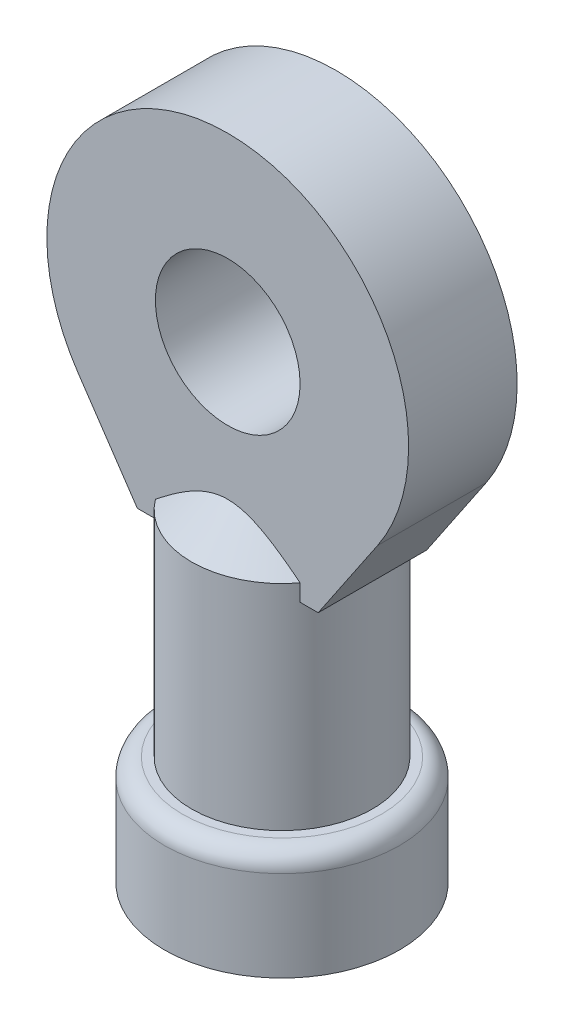
ISO-10303-21;
HEADER;
FILE_DESCRIPTION(('STEP AP214'),'2;1');
FILE_NAME('part.step','',(''),(''),'','','');
FILE_SCHEMA(('AUTOMOTIVE_DESIGN { 1 0 10303 214 1 1 1 1 }'));
ENDSEC;
DATA;
#1=APPLICATION_CONTEXT('core data for automotive mechanical design processes');
#2=APPLICATION_PROTOCOL_DEFINITION('international standard','automotive_design',2000,#1);
#3=PRODUCT_CONTEXT('',#1,'mechanical');
#4=PRODUCT('Part','Part','',(#3));
#5=PRODUCT_RELATED_PRODUCT_CATEGORY('part','',(#4));
#6=PRODUCT_DEFINITION_FORMATION('','',#4);
#7=PRODUCT_DEFINITION_CONTEXT('part definition',#1,'design');
#8=PRODUCT_DEFINITION('design','',#6,#7);
#9=PRODUCT_DEFINITION_SHAPE('','',#8);
#10=(LENGTH_UNIT() NAMED_UNIT(*) SI_UNIT(.MILLI.,.METRE.));
#11=(NAMED_UNIT(*) PLANE_ANGLE_UNIT() SI_UNIT($,.RADIAN.));
#12=(NAMED_UNIT(*) SI_UNIT($,.STERADIAN.) SOLID_ANGLE_UNIT());
#13=UNCERTAINTY_MEASURE_WITH_UNIT(LENGTH_MEASURE(1.E-05),#10,'distance_accuracy_value','');
#14=(GEOMETRIC_REPRESENTATION_CONTEXT(3) GLOBAL_UNCERTAINTY_ASSIGNED_CONTEXT((#13)) GLOBAL_UNIT_ASSIGNED_CONTEXT((#10,
#11,#12)) REPRESENTATION_CONTEXT('',''));
#15=CARTESIAN_POINT('',(0.,0.,0.));
#16=DIRECTION('',(0.,0.,1.));
#17=DIRECTION('',(1.,0.,0.));
#18=AXIS2_PLACEMENT_3D('',#15,#16,#17);
#19=CARTESIAN_POINT('',(0.,19.83,0.));
#20=DIRECTION('',(0.,-1.,0.));
#21=DIRECTION('',(0.,0.,-1.));
#22=AXIS2_PLACEMENT_3D('',#19,#20,#21);
#23=CYLINDRICAL_SURFACE('',#22,5.);
#24=CARTESIAN_POINT('',(0.,6.,0.));
#25=DIRECTION('',(0.,1.,0.));
#26=DIRECTION('',(0.,0.,1.));
#27=AXIS2_PLACEMENT_3D('',#24,#25,#26);
#28=CIRCLE('',#27,5.);
#29=CARTESIAN_POINT('',(0.,6.,5.));
#30=VERTEX_POINT('',#29);
#31=EDGE_CURVE('E173',#30,#30,#28,.T.);
#32=ORIENTED_EDGE('',*,*,#31,.T.);
#33=EDGE_LOOP('',(#32));
#34=FACE_BOUND('',#33,.T.);
#35=DIRECTION('',(0.,-1.,0.));
#36=VECTOR('',#35,1.);
#37=CARTESIAN_POINT('',(4.,19.83,3.));
#38=LINE('',#37,#36);
#39=CARTESIAN_POINT('',(4.,17.83,3.));
#40=VERTEX_POINT('',#39);
#41=CARTESIAN_POINT('',(4.,16.9,3.));
#42=VERTEX_POINT('',#41);
#43=EDGE_CURVE('E136',#40,#42,#38,.T.);
#44=ORIENTED_EDGE('',*,*,#43,.F.);
#45=CARTESIAN_POINT('',(0.,17.83,0.));
#46=DIRECTION('',(0.,1.,0.));
#47=DIRECTION('',(0.,0.,1.));
#48=AXIS2_PLACEMENT_3D('',#45,#46,#47);
#49=CIRCLE('',#48,5.);
#50=CARTESIAN_POINT('',(-4.,17.83,3.));
#51=VERTEX_POINT('',#50);
#52=EDGE_CURVE('E194',#40,#51,#49,.F.);
#53=ORIENTED_EDGE('',*,*,#52,.T.);
#54=DIRECTION('',(0.,-1.,0.));
#55=VECTOR('',#54,1.);
#56=CARTESIAN_POINT('',(-4.,19.83,3.));
#57=LINE('',#56,#55);
#58=CARTESIAN_POINT('',(-4.,16.9,3.));
#59=VERTEX_POINT('',#58);
#60=EDGE_CURVE('E166',#59,#51,#57,.F.);
#61=ORIENTED_EDGE('',*,*,#60,.F.);
#62=CARTESIAN_POINT('',(0.,16.9,0.));
#63=DIRECTION('',(0.,1.,0.));
#64=DIRECTION('',(0.,0.,1.));
#65=AXIS2_PLACEMENT_3D('',#62,#63,#64);
#66=CIRCLE('',#65,5.);
#67=CARTESIAN_POINT('',(-5.,16.9,0.));
#68=VERTEX_POINT('',#67);
#69=EDGE_CURVE('E187',#68,#59,#66,.T.);
#70=ORIENTED_EDGE('',*,*,#69,.F.);
#71=CARTESIAN_POINT('',(-4.,16.9,-3.));
#72=VERTEX_POINT('',#71);
#73=EDGE_CURVE('E190',#72,#68,#66,.T.);
#74=ORIENTED_EDGE('',*,*,#73,.F.);
#75=DIRECTION('',(0.,-1.,0.));
#76=VECTOR('',#75,1.);
#77=CARTESIAN_POINT('',(-4.,19.83,-3.));
#78=LINE('',#77,#76);
#79=CARTESIAN_POINT('',(-4.,17.83,-3.));
#80=VERTEX_POINT('',#79);
#81=EDGE_CURVE('E156',#72,#80,#78,.F.);
#82=ORIENTED_EDGE('',*,*,#81,.T.);
#83=CARTESIAN_POINT('',(0.,17.83,0.));
#84=DIRECTION('',(0.,1.,0.));
#85=DIRECTION('',(0.,0.,1.));
#86=AXIS2_PLACEMENT_3D('',#83,#84,#85);
#87=CIRCLE('',#86,5.);
#88=CARTESIAN_POINT('',(4.,17.83,-3.));
#89=VERTEX_POINT('',#88);
#90=EDGE_CURVE('E191',#80,#89,#87,.F.);
#91=ORIENTED_EDGE('',*,*,#90,.T.);
#92=DIRECTION('',(0.,-1.,0.));
#93=VECTOR('',#92,1.);
#94=CARTESIAN_POINT('',(4.,19.83,-3.));
#95=LINE('',#94,#93);
#96=CARTESIAN_POINT('',(4.,16.9,-3.));
#97=VERTEX_POINT('',#96);
#98=EDGE_CURVE('E160',#89,#97,#95,.T.);
#99=ORIENTED_EDGE('',*,*,#98,.T.);
#100=CARTESIAN_POINT('',(5.,16.9,0.));
#101=VERTEX_POINT('',#100);
#102=EDGE_CURVE('E480',#101,#97,#66,.T.);
#103=ORIENTED_EDGE('',*,*,#102,.F.);
#104=EDGE_CURVE('E154',#42,#101,#66,.T.);
#105=ORIENTED_EDGE('',*,*,#104,.F.);
#106=EDGE_LOOP('',(#44,#53,#61,#70,#74,#82,#91,#99,#103,#105));
#107=FACE_BOUND('',#106,.T.);
#108=ADVANCED_FACE('F50',(#34,#107),#23,.T.);
#109=CARTESIAN_POINT('',(0.,6.,0.));
#110=DIRECTION('',(0.,-1.,0.));
#111=DIRECTION('',(0.,0.,-1.));
#112=AXIS2_PLACEMENT_3D('',#109,#110,#111);
#113=CYLINDRICAL_SURFACE('',#112,6.5);
#114=CARTESIAN_POINT('',(0.,5.,0.));
#115=DIRECTION('',(0.,1.,0.));
#116=DIRECTION('',(0.,0.,1.));
#117=AXIS2_PLACEMENT_3D('',#114,#115,#116);
#118=CIRCLE('',#117,6.5);
#119=CARTESIAN_POINT('',(0.,5.,6.5));
#120=VERTEX_POINT('',#119);
#121=EDGE_CURVE('E184',#120,#120,#118,.F.);
#122=ORIENTED_EDGE('',*,*,#121,.T.);
#123=EDGE_LOOP('',(#122));
#124=FACE_BOUND('',#123,.T.);
#125=CARTESIAN_POINT('',(0.,0.,0.));
#126=DIRECTION('',(0.,1.,0.));
#127=DIRECTION('',(0.,0.,1.));
#128=AXIS2_PLACEMENT_3D('',#125,#126,#127);
#129=CIRCLE('',#128,6.5);
#130=CARTESIAN_POINT('',(0.,0.,6.5));
#131=VERTEX_POINT('',#130);
#132=EDGE_CURVE('E178',#131,#131,#129,.T.);
#133=ORIENTED_EDGE('',*,*,#132,.T.);
#134=EDGE_LOOP('',(#133));
#135=FACE_BOUND('',#134,.T.);
#136=ADVANCED_FACE('F226',(#124,#135),#113,.T.);
#137=CARTESIAN_POINT('',(0.,6.,0.));
#138=DIRECTION('',(0.,1.,0.));
#139=DIRECTION('',(0.,0.,1.));
#140=AXIS2_PLACEMENT_3D('',#137,#138,#139);
#141=PLANE('',#140);
#142=ORIENTED_EDGE('',*,*,#31,.F.);
#143=EDGE_LOOP('',(#142));
#144=FACE_BOUND('',#143,.T.);
#145=CARTESIAN_POINT('',(0.,6.,0.));
#146=DIRECTION('',(0.,1.,0.));
#147=DIRECTION('',(0.,0.,1.));
#148=AXIS2_PLACEMENT_3D('',#145,#146,#147);
#149=CIRCLE('',#148,5.5);
#150=CARTESIAN_POINT('',(0.,6.,5.5));
#151=VERTEX_POINT('',#150);
#152=EDGE_CURVE('E181',#151,#151,#149,.T.);
#153=ORIENTED_EDGE('',*,*,#152,.T.);
#154=EDGE_LOOP('',(#153));
#155=FACE_BOUND('',#154,.T.);
#156=ADVANCED_FACE('F229',(#144,#155),#141,.T.);
#157=CARTESIAN_POINT('',(0.,0.,0.));
#158=DIRECTION('',(0.,1.,0.));
#159=DIRECTION('',(0.,0.,1.));
#160=AXIS2_PLACEMENT_3D('',#157,#158,#159);
#161=PLANE('',#160);
#162=CARTESIAN_POINT('',(0.,0.,0.));
#163=DIRECTION('',(0.,-1.,0.));
#164=DIRECTION('',(0.,0.,-1.));
#165=AXIS2_PLACEMENT_3D('',#162,#163,#164);
#166=CIRCLE('',#165,3.);
#167=CARTESIAN_POINT('',(0.,0.,-3.));
#168=VERTEX_POINT('',#167);
#169=EDGE_CURVE('E169',#168,#168,#166,.T.);
#170=ORIENTED_EDGE('',*,*,#169,.F.);
#171=EDGE_LOOP('',(#170));
#172=FACE_BOUND('',#171,.T.);
#173=ORIENTED_EDGE('',*,*,#132,.F.);
#174=EDGE_LOOP('',(#173));
#175=FACE_BOUND('',#174,.T.);
#176=ADVANCED_FACE('F224',(#172,#175),#161,.F.);
#177=CARTESIAN_POINT('',(0.,5.,0.));
#178=DIRECTION('',(0.,1.,0.));
#179=DIRECTION('',(0.,0.,1.));
#180=AXIS2_PLACEMENT_3D('',#177,#178,#179);
#181=TOROIDAL_SURFACE('',#180,5.5,1.);
#182=ORIENTED_EDGE('',*,*,#121,.F.);
#183=EDGE_LOOP('',(#182));
#184=FACE_BOUND('',#183,.T.);
#185=ORIENTED_EDGE('',*,*,#152,.F.);
#186=EDGE_LOOP('',(#185));
#187=FACE_BOUND('',#186,.T.);
#188=ADVANCED_FACE('F219',(#184,#187),#181,.T.);
#189=CARTESIAN_POINT('',(0.,15.,0.));
#190=DIRECTION('',(0.,-1.,0.));
#191=DIRECTION('',(0.,0.,-1.));
#192=AXIS2_PLACEMENT_3D('',#189,#190,#191);
#193=CYLINDRICAL_SURFACE('',#192,3.);
#194=CARTESIAN_POINT('',(0.,15.,0.));
#195=DIRECTION('',(0.,-1.,0.));
#196=DIRECTION('',(0.,0.,-1.));
#197=AXIS2_PLACEMENT_3D('',#194,#195,#196);
#198=CIRCLE('',#197,3.);
#199=CARTESIAN_POINT('',(0.,15.,-3.));
#200=VERTEX_POINT('',#199);
#201=EDGE_CURVE('E170',#200,#200,#198,.T.);
#202=ORIENTED_EDGE('',*,*,#201,.F.);
#203=EDGE_LOOP('',(#202));
#204=FACE_BOUND('',#203,.T.);
#205=ORIENTED_EDGE('',*,*,#169,.T.);
#206=EDGE_LOOP('',(#205));
#207=FACE_BOUND('',#206,.T.);
#208=ADVANCED_FACE('F223',(#204,#207),#193,.F.);
#209=CARTESIAN_POINT('',(0.,15.,0.));
#210=DIRECTION('',(0.,-1.,0.));
#211=DIRECTION('',(0.,0.,-1.));
#212=AXIS2_PLACEMENT_3D('',#209,#210,#211);
#213=PLANE('',#212);
#214=ORIENTED_EDGE('',*,*,#201,.T.);
#215=EDGE_LOOP('',(#214));
#216=FACE_BOUND('',#215,.T.);
#217=ADVANCED_FACE('F242',(#216),#213,.T.);
#218=CARTESIAN_POINT('',(-5.,16.9,3.));
#219=DIRECTION('',(0.,1.,0.));
#220=DIRECTION('',(0.,0.,1.));
#221=AXIS2_PLACEMENT_3D('',#218,#219,#220);
#222=PLANE('',#221);
#223=DIRECTION('',(1.,0.,0.));
#224=VECTOR('',#223,1.);
#225=CARTESIAN_POINT('',(-5.,16.9,3.));
#226=LINE('',#225,#224);
#227=CARTESIAN_POINT('',(5.,16.9,3.));
#228=VERTEX_POINT('',#227);
#229=EDGE_CURVE('E130',#42,#228,#226,.T.);
#230=ORIENTED_EDGE('',*,*,#229,.F.);
#231=ORIENTED_EDGE('',*,*,#104,.T.);
#232=DIRECTION('',(0.,0.,-1.));
#233=VECTOR('',#232,1.);
#234=CARTESIAN_POINT('',(5.,16.9,3.));
#235=LINE('',#234,#233);
#236=EDGE_CURVE('E147',#228,#101,#235,.T.);
#237=ORIENTED_EDGE('',*,*,#236,.F.);
#238=EDGE_LOOP('',(#230,#231,#237));
#239=FACE_BOUND('',#238,.T.);
#240=ADVANCED_FACE('F153',(#239),#222,.F.);
#241=CARTESIAN_POINT('',(5.,16.9,-3.));
#242=VERTEX_POINT('',#241);
#243=EDGE_CURVE('E157',#101,#242,#235,.T.);
#244=ORIENTED_EDGE('',*,*,#243,.F.);
#245=ORIENTED_EDGE('',*,*,#102,.T.);
#246=DIRECTION('',(1.,0.,0.));
#247=VECTOR('',#246,1.);
#248=CARTESIAN_POINT('',(-5.,16.9,-3.));
#249=LINE('',#248,#247);
#250=EDGE_CURVE('E482',#97,#242,#249,.T.);
#251=ORIENTED_EDGE('',*,*,#250,.T.);
#252=EDGE_LOOP('',(#244,#245,#251));
#253=FACE_BOUND('',#252,.T.);
#254=ADVANCED_FACE('F322',(#253),#222,.F.);
#255=CARTESIAN_POINT('',(-5.,16.9,-3.));
#256=VERTEX_POINT('',#255);
#257=EDGE_CURVE('E487',#256,#72,#249,.T.);
#258=ORIENTED_EDGE('',*,*,#257,.T.);
#259=ORIENTED_EDGE('',*,*,#73,.T.);
#260=DIRECTION('',(0.,0.,-1.));
#261=VECTOR('',#260,1.);
#262=CARTESIAN_POINT('',(-5.,16.9,3.));
#263=LINE('',#262,#261);
#264=EDGE_CURVE('E500',#68,#256,#263,.T.);
#265=ORIENTED_EDGE('',*,*,#264,.T.);
#266=EDGE_LOOP('',(#258,#259,#265));
#267=FACE_BOUND('',#266,.T.);
#268=ADVANCED_FACE('F252',(#267),#222,.F.);
#269=CARTESIAN_POINT('',(0.,27.3624149617181,3.));
#270=DIRECTION('',(0.,0.,-1.));
#271=DIRECTION('',(-1.,0.,0.));
#272=AXIS2_PLACEMENT_3D('',#269,#270,#271);
#273=PLANE('',#272);
#274=CARTESIAN_POINT('',(0.,27.3624149617181,3.));
#275=DIRECTION('',(0.,0.,1.));
#276=DIRECTION('',(1.,0.,0.));
#277=AXIS2_PLACEMENT_3D('',#274,#275,#276);
#278=CIRCLE('',#277,4.);
#279=CARTESIAN_POINT('',(3.99999999999999,27.3624149617181,3.));
#280=VERTEX_POINT('',#279);
#281=EDGE_CURVE('E509',#280,#280,#278,.T.);
#282=ORIENTED_EDGE('',*,*,#281,.F.);
#283=EDGE_LOOP('',(#282));
#284=FACE_BOUND('',#283,.T.);
#285=ORIENTED_EDGE('',*,*,#60,.T.);
#286=CARTESIAN_POINT('',(-4.,17.83,3.));
#287=CARTESIAN_POINT('',(-3.9257954333642,17.889360046507,3.));
#288=CARTESIAN_POINT('',(-3.85130485581146,17.9483621288463,3.));
#289=CARTESIAN_POINT('',(-3.70166408680893,18.0655329657146,3.));
#290=CARTESIAN_POINT('',(-3.62651385490908,18.1237016685569,3.));
#291=CARTESIAN_POINT('',(-3.39969556522372,18.2969696430062,3.));
#292=CARTESIAN_POINT('',(-3.24691531891323,18.4106251660814,3.));
#293=CARTESIAN_POINT('',(-2.93211449391184,18.6365707607265,3.));
#294=CARTESIAN_POINT('',(-2.76995789724142,18.7486723113401,3.));
#295=CARTESIAN_POINT('',(-2.44040261478515,18.9647651147938,3.));
#296=CARTESIAN_POINT('',(-2.27300778541996,19.0687621461107,3.));
#297=CARTESIAN_POINT('',(-1.99693959088118,19.2271694347975,3.));
#298=CARTESIAN_POINT('',(-1.89040156559757,19.2852855890736,3.));
#299=CARTESIAN_POINT('',(-1.6742714350558,19.3956819858226,3.));
#300=CARTESIAN_POINT('',(-1.5646784809378,19.4479605856269,3.));
#301=CARTESIAN_POINT('',(-1.34357970451426,19.5443588600513,3.));
#302=CARTESIAN_POINT('',(-1.23211579246086,19.5885736345442,3.));
#303=CARTESIAN_POINT('',(-1.00594529625432,19.6676058360644,3.));
#304=CARTESIAN_POINT('',(-0.891242038833608,19.7024325425944,3.));
#305=CARTESIAN_POINT('',(-0.712159611013103,19.747233062674,3.));
#306=CARTESIAN_POINT('',(-0.64878961017292,19.7612844997648,3.));
#307=CARTESIAN_POINT('',(-0.521346014607512,19.7856788260754,3.));
#308=CARTESIAN_POINT('',(-0.45727258385786,19.7960225614375,3.));
#309=CARTESIAN_POINT('',(-0.327834374494874,19.8128293992995,3.));
#310=CARTESIAN_POINT('',(-0.262463319235632,19.8192445636439,3.));
#311=CARTESIAN_POINT('',(-0.131398103197851,19.827842101814,3.));
#312=CARTESIAN_POINT('',(-0.065703745070992,19.8300214505836,3.));
#313=CARTESIAN_POINT('',(0.,19.83,3.));
#314=B_SPLINE_CURVE_WITH_KNOTS('',3,(#286,#287,#288,#289,#290,#291,#292,#293,#294,#295,#296,
#297,#298,#299,#300,#301,#302,#303,#304,#305,#306,#307,#308,#309,#310,#311,#312,#313),
.UNSPECIFIED.,.F.,.F.,(4,2,2,2,2,2,2,2,2,2,2,2,2,4),(0.,0.285075346497054,0.570168297685431,
1.14133762065735,1.73258973397109,2.32341635583755,2.68735700908752,3.05139981731678,
3.41082388918196,3.76989137977574,3.96452572214081,4.1591156182755,4.3560349873879,
4.55309493711648),.UNSPECIFIED.);
#315=CARTESIAN_POINT('',(0.,19.83,3.));
#316=VERTEX_POINT('',#315);
#317=EDGE_CURVE('E78',#51,#316,#314,.T.);
#318=ORIENTED_EDGE('',*,*,#317,.T.);
#319=CARTESIAN_POINT('',(0.,19.83,3.));
#320=CARTESIAN_POINT('',(0.0461354149614643,19.8300037117786,3.));
#321=CARTESIAN_POINT('',(0.0922640277093607,19.8289352245833,3.));
#322=CARTESIAN_POINT('',(0.184416680619138,19.8246888120775,3.));
#323=CARTESIAN_POINT('',(0.230440736748749,19.821511234124,3.));
#324=CARTESIAN_POINT('',(0.368036457523087,19.8088856533932,3.));
#325=CARTESIAN_POINT('',(0.459339297965601,19.7963444876512,3.));
#326=CARTESIAN_POINT('',(0.638977068949257,19.7639590452689,3.));
#327=CARTESIAN_POINT('',(0.727336021727737,19.7442447261478,3.));
#328=CARTESIAN_POINT('',(0.902384001967858,19.698361338527,3.));
#329=CARTESIAN_POINT('',(0.989072205161269,19.6721891676855,3.));
#330=CARTESIAN_POINT('',(1.26292543586138,19.5798348932247,3.));
#331=CARTESIAN_POINT('',(1.44655924771287,19.5031749215916,3.));
#332=CARTESIAN_POINT('',(1.80544207744851,19.3321996496546,3.));
#333=CARTESIAN_POINT('',(1.98067448843214,19.2378510563573,3.));
#334=CARTESIAN_POINT('',(2.32681009505144,19.0360524918896,3.));
#335=CARTESIAN_POINT('',(2.49761109623948,18.928429569228,3.));
#336=CARTESIAN_POINT('',(2.83365641324508,18.7052130258883,3.));
#337=CARTESIAN_POINT('',(2.99890492219253,18.5896256306687,3.));
#338=CARTESIAN_POINT('',(3.30553517076392,18.3671697844251,3.));
#339=CARTESIAN_POINT('',(3.44738385436704,18.2609404844885,3.));
#340=CARTESIAN_POINT('',(3.65721519692228,18.0999620009517,3.));
#341=CARTESIAN_POINT('',(3.72615045822999,18.0464469919683,3.));
#342=CARTESIAN_POINT('',(3.86347105483987,17.9387220167003,3.));
#343=CARTESIAN_POINT('',(3.93185641473693,17.8845120817815,3.));
#344=CARTESIAN_POINT('',(4.,17.83,3.));
#345=B_SPLINE_CURVE_WITH_KNOTS('',3,(#319,#320,#321,#322,#323,#324,#325,#326,#327,#328,#329,
#330,#331,#332,#333,#334,#335,#336,#337,#338,#339,#340,#341,#342,#343,#344),.UNSPECIFIED.,.F.,
.F.,(4,2,2,2,2,2,2,2,2,2,2,2,4),(0.,0.13838087864586,0.276738972285155,0.552834640213537,
0.824158840019252,1.09561363818839,1.69096802813074,2.28745443526048,2.8927524825927,
3.49758264932597,4.02917096400334,4.29097525092169,4.55276776251417),.UNSPECIFIED.);
#346=EDGE_CURVE('E197',#316,#40,#345,.T.);
#347=ORIENTED_EDGE('',*,*,#346,.T.);
#348=ORIENTED_EDGE('',*,*,#43,.T.);
#349=ORIENTED_EDGE('',*,*,#229,.T.);
#350=DIRECTION('',(0.559800186100591,0.828627631473718,0.));
#351=VECTOR('',#350,1.);
#352=CARTESIAN_POINT('',(5.,16.9,3.));
#353=LINE('',#352,#351);
#354=CARTESIAN_POINT('',(8.28627631473718,21.7644131007122,3.));
#355=VERTEX_POINT('',#354);
#356=EDGE_CURVE('E133',#228,#355,#353,.T.);
#357=ORIENTED_EDGE('',*,*,#356,.T.);
#358=CARTESIAN_POINT('',(0.,27.3624149617181,3.));
#359=DIRECTION('',(0.,0.,1.));
#360=DIRECTION('',(-1.,0.,0.));
#361=AXIS2_PLACEMENT_3D('',#358,#359,#360);
#362=CIRCLE('',#361,10.);
#363=CARTESIAN_POINT('',(-8.28627631473718,21.7644131007122,3.));
#364=VERTEX_POINT('',#363);
#365=EDGE_CURVE('E151',#355,#364,#362,.T.);
#366=ORIENTED_EDGE('',*,*,#365,.T.);
#367=DIRECTION('',(0.559800186100591,-0.828627631473718,0.));
#368=VECTOR('',#367,1.);
#369=CARTESIAN_POINT('',(-5.,16.9,3.));
#370=LINE('',#369,#368);
#371=CARTESIAN_POINT('',(-5.,16.9,3.));
#372=VERTEX_POINT('',#371);
#373=EDGE_CURVE('E504',#364,#372,#370,.T.);
#374=ORIENTED_EDGE('',*,*,#373,.T.);
#375=EDGE_CURVE('E141',#372,#59,#226,.T.);
#376=ORIENTED_EDGE('',*,*,#375,.T.);
#377=EDGE_LOOP('',(#285,#318,#347,#348,#349,#357,#366,#374,#376));
#378=FACE_BOUND('',#377,.T.);
#379=ADVANCED_FACE('F132',(#284,#378),#273,.F.);
#380=CARTESIAN_POINT('',(0.,27.3624149617181,-3.));
#381=DIRECTION('',(0.,0.,-1.));
#382=DIRECTION('',(-1.,0.,0.));
#383=AXIS2_PLACEMENT_3D('',#380,#381,#382);
#384=PLANE('',#383);
#385=CARTESIAN_POINT('',(0.,27.3624149617181,-3.));
#386=DIRECTION('',(0.,0.,1.));
#387=DIRECTION('',(1.,0.,0.));
#388=AXIS2_PLACEMENT_3D('',#385,#386,#387);
#389=CIRCLE('',#388,4.);
#390=CARTESIAN_POINT('',(3.99999999999999,27.3624149617181,-3.));
#391=VERTEX_POINT('',#390);
#392=EDGE_CURVE('E511',#391,#391,#389,.T.);
#393=ORIENTED_EDGE('',*,*,#392,.T.);
#394=EDGE_LOOP('',(#393));
#395=FACE_BOUND('',#394,.T.);
#396=ORIENTED_EDGE('',*,*,#98,.F.);
#397=CARTESIAN_POINT('',(4.,17.83,-3.));
#398=CARTESIAN_POINT('',(3.9257954333642,17.889360046507,-3.));
#399=CARTESIAN_POINT('',(3.85130485581146,17.9483621288463,-3.));
#400=CARTESIAN_POINT('',(3.70166408680893,18.0655329657146,-3.));
#401=CARTESIAN_POINT('',(3.62651385490908,18.1237016685569,-3.));
#402=CARTESIAN_POINT('',(3.39969556522372,18.2969696430062,-3.));
#403=CARTESIAN_POINT('',(3.24691531891323,18.4106251660814,-3.));
#404=CARTESIAN_POINT('',(2.93211449391184,18.6365707607265,-3.));
#405=CARTESIAN_POINT('',(2.76995789724142,18.7486723113401,-3.));
#406=CARTESIAN_POINT('',(2.44040261478515,18.9647651147938,-3.));
#407=CARTESIAN_POINT('',(2.27300778541996,19.0687621461107,-3.));
#408=CARTESIAN_POINT('',(1.99693959088118,19.2271694347975,-3.));
#409=CARTESIAN_POINT('',(1.89040156559757,19.2852855890736,-3.));
#410=CARTESIAN_POINT('',(1.6742714350558,19.3956819858226,-3.));
#411=CARTESIAN_POINT('',(1.5646784809378,19.4479605856269,-3.));
#412=CARTESIAN_POINT('',(1.34357970451426,19.5443588600513,-3.));
#413=CARTESIAN_POINT('',(1.23211579246086,19.5885736345442,-3.));
#414=CARTESIAN_POINT('',(1.00594529625432,19.6676058360644,-3.));
#415=CARTESIAN_POINT('',(0.891242038833608,19.7024325425944,-3.));
#416=CARTESIAN_POINT('',(0.712159611013103,19.747233062674,-3.));
#417=CARTESIAN_POINT('',(0.64878961017292,19.7612844997648,-3.));
#418=CARTESIAN_POINT('',(0.521346014607512,19.7856788260754,-3.));
#419=CARTESIAN_POINT('',(0.45727258385786,19.7960225614375,-3.));
#420=CARTESIAN_POINT('',(0.327834374494874,19.8128293992995,-3.));
#421=CARTESIAN_POINT('',(0.262463319235632,19.8192445636439,-3.));
#422=CARTESIAN_POINT('',(0.131398103197851,19.827842101814,-3.));
#423=CARTESIAN_POINT('',(0.065703745070992,19.8300214505836,-3.));
#424=CARTESIAN_POINT('',(0.,19.83,-3.));
#425=B_SPLINE_CURVE_WITH_KNOTS('',3,(#397,#398,#399,#400,#401,#402,#403,#404,#405,#406,#407,
#408,#409,#410,#411,#412,#413,#414,#415,#416,#417,#418,#419,#420,#421,#422,#423,#424),
.UNSPECIFIED.,.F.,.F.,(4,2,2,2,2,2,2,2,2,2,2,2,2,4),(0.,0.285075346497054,0.570168297685431,
1.14133762065735,1.73258973397109,2.32341635583755,2.68735700908752,3.05139981731678,
3.41082388918196,3.76989137977574,3.96452572214081,4.1591156182755,4.3560349873879,
4.55309493711648),.UNSPECIFIED.);
#426=CARTESIAN_POINT('',(0.,19.83,-3.));
#427=VERTEX_POINT('',#426);
#428=EDGE_CURVE('E11',#89,#427,#425,.T.);
#429=ORIENTED_EDGE('',*,*,#428,.T.);
#430=CARTESIAN_POINT('',(0.,19.83,-3.));
#431=CARTESIAN_POINT('',(-0.0461354149614643,19.8300037117786,-3.));
#432=CARTESIAN_POINT('',(-0.0922640277093607,19.8289352245833,-3.));
#433=CARTESIAN_POINT('',(-0.184416680619138,19.8246888120775,-3.));
#434=CARTESIAN_POINT('',(-0.230440736748749,19.821511234124,-3.));
#435=CARTESIAN_POINT('',(-0.368036457523087,19.8088856533932,-3.));
#436=CARTESIAN_POINT('',(-0.459339297965601,19.7963444876512,-3.));
#437=CARTESIAN_POINT('',(-0.638977068949257,19.7639590452689,-3.));
#438=CARTESIAN_POINT('',(-0.727336021727737,19.7442447261478,-3.));
#439=CARTESIAN_POINT('',(-0.902384001967858,19.698361338527,-3.));
#440=CARTESIAN_POINT('',(-0.989072205161269,19.6721891676855,-3.));
#441=CARTESIAN_POINT('',(-1.26292543586138,19.5798348932247,-3.));
#442=CARTESIAN_POINT('',(-1.44655924771287,19.5031749215916,-3.));
#443=CARTESIAN_POINT('',(-1.80544207744851,19.3321996496546,-3.));
#444=CARTESIAN_POINT('',(-1.98067448843214,19.2378510563573,-3.));
#445=CARTESIAN_POINT('',(-2.32681009505144,19.0360524918896,-3.));
#446=CARTESIAN_POINT('',(-2.49761109623948,18.928429569228,-3.));
#447=CARTESIAN_POINT('',(-2.83365641324508,18.7052130258883,-3.));
#448=CARTESIAN_POINT('',(-2.99890492219253,18.5896256306687,-3.));
#449=CARTESIAN_POINT('',(-3.30553517076392,18.3671697844251,-3.));
#450=CARTESIAN_POINT('',(-3.44738385436704,18.2609404844885,-3.));
#451=CARTESIAN_POINT('',(-3.65721519692228,18.0999620009517,-3.));
#452=CARTESIAN_POINT('',(-3.72615045822999,18.0464469919683,-3.));
#453=CARTESIAN_POINT('',(-3.86347105483987,17.9387220167003,-3.));
#454=CARTESIAN_POINT('',(-3.93185641473693,17.8845120817815,-3.));
#455=CARTESIAN_POINT('',(-4.,17.83,-3.));
#456=B_SPLINE_CURVE_WITH_KNOTS('',3,(#430,#431,#432,#433,#434,#435,#436,#437,#438,#439,#440,
#441,#442,#443,#444,#445,#446,#447,#448,#449,#450,#451,#452,#453,#454,#455),.UNSPECIFIED.,.F.,
.F.,(4,2,2,2,2,2,2,2,2,2,2,2,4),(0.,0.13838087864586,0.276738972285155,0.552834640213537,
0.824158840019252,1.09561363818839,1.69096802813074,2.28745443526048,2.8927524825927,
3.49758264932597,4.02917096400334,4.29097525092169,4.55276776251417),.UNSPECIFIED.);
#457=EDGE_CURVE('E65',#427,#80,#456,.T.);
#458=ORIENTED_EDGE('',*,*,#457,.T.);
#459=ORIENTED_EDGE('',*,*,#81,.F.);
#460=ORIENTED_EDGE('',*,*,#257,.F.);
#461=DIRECTION('',(0.559800186100591,-0.828627631473718,0.));
#462=VECTOR('',#461,1.);
#463=CARTESIAN_POINT('',(-5.,16.9,-3.));
#464=LINE('',#463,#462);
#465=CARTESIAN_POINT('',(-8.28627631473718,21.7644131007122,-3.));
#466=VERTEX_POINT('',#465);
#467=EDGE_CURVE('E142',#466,#256,#464,.T.);
#468=ORIENTED_EDGE('',*,*,#467,.F.);
#469=CARTESIAN_POINT('',(0.,27.3624149617181,-3.));
#470=DIRECTION('',(0.,0.,1.));
#471=DIRECTION('',(-1.,0.,0.));
#472=AXIS2_PLACEMENT_3D('',#469,#470,#471);
#473=CIRCLE('',#472,10.);
#474=CARTESIAN_POINT('',(8.28627631473718,21.7644131007122,-3.));
#475=VERTEX_POINT('',#474);
#476=EDGE_CURVE('E486',#475,#466,#473,.T.);
#477=ORIENTED_EDGE('',*,*,#476,.F.);
#478=DIRECTION('',(0.559800186100591,0.828627631473718,0.));
#479=VECTOR('',#478,1.);
#480=CARTESIAN_POINT('',(5.,16.9,-3.));
#481=LINE('',#480,#479);
#482=EDGE_CURVE('E484',#242,#475,#481,.T.);
#483=ORIENTED_EDGE('',*,*,#482,.F.);
#484=ORIENTED_EDGE('',*,*,#250,.F.);
#485=EDGE_LOOP('',(#396,#429,#458,#459,#460,#468,#477,#483,#484));
#486=FACE_BOUND('',#485,.T.);
#487=ADVANCED_FACE('F250',(#395,#486),#384,.T.);
#488=EDGE_CURVE('E498',#372,#68,#263,.T.);
#489=ORIENTED_EDGE('',*,*,#488,.T.);
#490=ORIENTED_EDGE('',*,*,#69,.T.);
#491=ORIENTED_EDGE('',*,*,#375,.F.);
#492=EDGE_LOOP('',(#489,#490,#491));
#493=FACE_BOUND('',#492,.T.);
#494=ADVANCED_FACE('F247',(#493),#222,.F.);
#495=CARTESIAN_POINT('',(5.,16.9,3.));
#496=DIRECTION('',(-0.828627631473718,0.559800186100591,0.));
#497=DIRECTION('',(-0.559800186100591,-0.828627631473718,0.));
#498=AXIS2_PLACEMENT_3D('',#495,#496,#497);
#499=PLANE('',#498);
#500=ORIENTED_EDGE('',*,*,#482,.T.);
#501=DIRECTION('',(0.,0.,-1.));
#502=VECTOR('',#501,1.);
#503=CARTESIAN_POINT('',(8.28627631473718,21.7644131007122,3.));
#504=LINE('',#503,#502);
#505=EDGE_CURVE('E149',#355,#475,#504,.T.);
#506=ORIENTED_EDGE('',*,*,#505,.F.);
#507=ORIENTED_EDGE('',*,*,#356,.F.);
#508=ORIENTED_EDGE('',*,*,#236,.T.);
#509=ORIENTED_EDGE('',*,*,#243,.T.);
#510=EDGE_LOOP('',(#500,#506,#507,#508,#509));
#511=FACE_BOUND('',#510,.T.);
#512=ADVANCED_FACE('F146',(#511),#499,.F.);
#513=CARTESIAN_POINT('',(0.,27.3624149617181,3.));
#514=DIRECTION('',(0.,0.,-1.));
#515=DIRECTION('',(-1.,0.,0.));
#516=AXIS2_PLACEMENT_3D('',#513,#514,#515);
#517=CYLINDRICAL_SURFACE('',#516,10.);
#518=ORIENTED_EDGE('',*,*,#476,.T.);
#519=DIRECTION('',(0.,0.,-1.));
#520=VECTOR('',#519,1.);
#521=CARTESIAN_POINT('',(-8.28627631473718,21.7644131007122,3.));
#522=LINE('',#521,#520);
#523=EDGE_CURVE('E491',#364,#466,#522,.T.);
#524=ORIENTED_EDGE('',*,*,#523,.F.);
#525=ORIENTED_EDGE('',*,*,#365,.F.);
#526=ORIENTED_EDGE('',*,*,#505,.T.);
#527=EDGE_LOOP('',(#518,#524,#525,#526));
#528=FACE_BOUND('',#527,.T.);
#529=ADVANCED_FACE('F255',(#528),#517,.T.);
#530=CARTESIAN_POINT('',(-5.,16.9,3.));
#531=DIRECTION('',(0.828627631473718,0.559800186100591,0.));
#532=DIRECTION('',(-0.559800186100591,0.828627631473718,0.));
#533=AXIS2_PLACEMENT_3D('',#530,#531,#532);
#534=PLANE('',#533);
#535=ORIENTED_EDGE('',*,*,#467,.T.);
#536=ORIENTED_EDGE('',*,*,#264,.F.);
#537=ORIENTED_EDGE('',*,*,#488,.F.);
#538=ORIENTED_EDGE('',*,*,#373,.F.);
#539=ORIENTED_EDGE('',*,*,#523,.T.);
#540=EDGE_LOOP('',(#535,#536,#537,#538,#539));
#541=FACE_BOUND('',#540,.T.);
#542=ADVANCED_FACE('F258',(#541),#534,.F.);
#543=CARTESIAN_POINT('',(0.,27.3624149617181,3.));
#544=DIRECTION('',(0.,0.,-1.));
#545=DIRECTION('',(-1.,0.,0.));
#546=AXIS2_PLACEMENT_3D('',#543,#544,#545);
#547=CYLINDRICAL_SURFACE('',#546,4.);
#548=ORIENTED_EDGE('',*,*,#281,.T.);
#549=EDGE_LOOP('',(#548));
#550=FACE_BOUND('',#549,.T.);
#551=ORIENTED_EDGE('',*,*,#392,.F.);
#552=EDGE_LOOP('',(#551));
#553=FACE_BOUND('',#552,.T.);
#554=ADVANCED_FACE('F217',(#550,#553),#547,.F.);
#555=CARTESIAN_POINT('',(0.,19.83,0.));
#556=DIRECTION('',(0.,-1.,0.));
#557=DIRECTION('',(0.,0.,-1.));
#558=AXIS2_PLACEMENT_3D('',#555,#556,#557);
#559=CONICAL_SURFACE('',#558,3.,0.785398163397446);
#560=ORIENTED_EDGE('',*,*,#317,.F.);
#561=ORIENTED_EDGE('',*,*,#52,.F.);
#562=ORIENTED_EDGE('',*,*,#346,.F.);
#563=EDGE_LOOP('',(#560,#561,#562));
#564=FACE_BOUND('',#563,.T.);
#565=ADVANCED_FACE('F211',(#564),#559,.T.);
#566=CARTESIAN_POINT('',(0.,19.83,0.));
#567=DIRECTION('',(0.,-1.,0.));
#568=DIRECTION('',(0.,0.,-1.));
#569=AXIS2_PLACEMENT_3D('',#566,#567,#568);
#570=CONICAL_SURFACE('',#569,3.,0.785398163397446);
#571=ORIENTED_EDGE('',*,*,#428,.F.);
#572=ORIENTED_EDGE('',*,*,#90,.F.);
#573=ORIENTED_EDGE('',*,*,#457,.F.);
#574=EDGE_LOOP('',(#571,#572,#573));
#575=FACE_BOUND('',#574,.T.);
#576=ADVANCED_FACE('F53',(#575),#570,.T.);
#577=CLOSED_SHELL('',(#108,#136,#156,#176,#188,#208,#217,#240,#254,#268,#379,#487,#494,#512,
#529,#542,#554,#565,#576));
#578=MANIFOLD_SOLID_BREP('B2',#577);
#579=ADVANCED_BREP_SHAPE_REPRESENTATION('',(#18,#578),#14);
#580=SHAPE_DEFINITION_REPRESENTATION(#9,#579);
ENDSEC;
END-ISO-10303-21;
